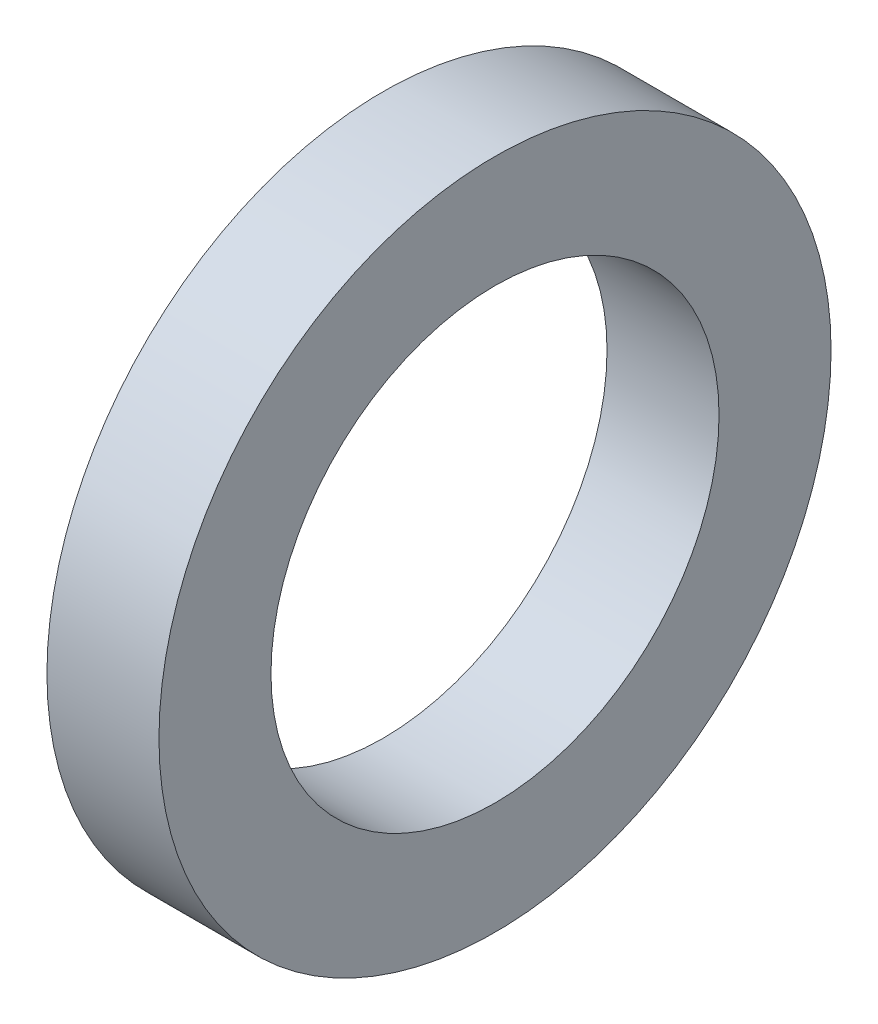
ISO-10303-21;
HEADER;
FILE_DESCRIPTION(('STEP AP214'),'2;1');
FILE_NAME('part.step','',(''),(''),'','','');
FILE_SCHEMA(('AUTOMOTIVE_DESIGN { 1 0 10303 214 1 1 1 1 }'));
ENDSEC;
DATA;
#1=APPLICATION_CONTEXT('core data for automotive mechanical design processes');
#2=APPLICATION_PROTOCOL_DEFINITION('international standard','automotive_design',2000,#1);
#3=PRODUCT_CONTEXT('',#1,'mechanical');
#4=PRODUCT('Part','Part','',(#3));
#5=PRODUCT_RELATED_PRODUCT_CATEGORY('part','',(#4));
#6=PRODUCT_DEFINITION_FORMATION('','',#4);
#7=PRODUCT_DEFINITION_CONTEXT('part definition',#1,'design');
#8=PRODUCT_DEFINITION('design','',#6,#7);
#9=PRODUCT_DEFINITION_SHAPE('','',#8);
#10=(LENGTH_UNIT() NAMED_UNIT(*) SI_UNIT(.MILLI.,.METRE.));
#11=(NAMED_UNIT(*) PLANE_ANGLE_UNIT() SI_UNIT($,.RADIAN.));
#12=(NAMED_UNIT(*) SI_UNIT($,.STERADIAN.) SOLID_ANGLE_UNIT());
#13=UNCERTAINTY_MEASURE_WITH_UNIT(LENGTH_MEASURE(1.E-05),#10,'distance_accuracy_value','');
#14=(GEOMETRIC_REPRESENTATION_CONTEXT(3) GLOBAL_UNCERTAINTY_ASSIGNED_CONTEXT((#13)) GLOBAL_UNIT_ASSIGNED_CONTEXT((#10,
#11,#12)) REPRESENTATION_CONTEXT('',''));
#15=CARTESIAN_POINT('',(0.,0.,0.));
#16=DIRECTION('',(0.,0.,1.));
#17=DIRECTION('',(1.,0.,0.));
#18=AXIS2_PLACEMENT_3D('',#15,#16,#17);
#19=CARTESIAN_POINT('',(-0.499999999999945,2.,0.));
#20=DIRECTION('',(1.,0.,0.));
#21=DIRECTION('',(0.,0.,-1.));
#22=AXIS2_PLACEMENT_3D('',#19,#20,#21);
#23=PLANE('',#22);
#24=CARTESIAN_POINT('',(-0.499999999999945,0.,0.));
#25=DIRECTION('',(-1.,0.,0.));
#26=DIRECTION('',(0.,0.,1.));
#27=AXIS2_PLACEMENT_3D('',#24,#25,#26);
#28=CIRCLE('',#27,2.);
#29=CARTESIAN_POINT('',(-0.499999999999945,0.,2.));
#30=VERTEX_POINT('',#29);
#31=EDGE_CURVE('E66',#30,#30,#28,.T.);
#32=ORIENTED_EDGE('',*,*,#31,.F.);
#33=EDGE_LOOP('',(#32));
#34=FACE_BOUND('',#33,.T.);
#35=CARTESIAN_POINT('',(-0.499999999999945,0.,0.));
#36=DIRECTION('',(-1.,0.,0.));
#37=DIRECTION('',(0.,0.,1.));
#38=AXIS2_PLACEMENT_3D('',#35,#36,#37);
#39=CIRCLE('',#38,3.);
#40=CARTESIAN_POINT('',(-0.499999999999945,0.,3.));
#41=VERTEX_POINT('',#40);
#42=EDGE_CURVE('E10',#41,#41,#39,.T.);
#43=ORIENTED_EDGE('',*,*,#42,.T.);
#44=EDGE_LOOP('',(#43));
#45=FACE_BOUND('',#44,.T.);
#46=ADVANCED_FACE('F45',(#34,#45),#23,.F.);
#47=CARTESIAN_POINT('',(-0.499999999999945,0.,0.));
#48=DIRECTION('',(-1.,0.,0.));
#49=DIRECTION('',(0.,0.,1.));
#50=AXIS2_PLACEMENT_3D('',#47,#48,#49);
#51=CYLINDRICAL_SURFACE('',#50,3.);
#52=ORIENTED_EDGE('',*,*,#42,.F.);
#53=EDGE_LOOP('',(#52));
#54=FACE_BOUND('',#53,.T.);
#55=CARTESIAN_POINT('',(0.499999999999945,0.,0.));
#56=DIRECTION('',(-1.,0.,0.));
#57=DIRECTION('',(0.,0.,1.));
#58=AXIS2_PLACEMENT_3D('',#55,#56,#57);
#59=CIRCLE('',#58,3.);
#60=CARTESIAN_POINT('',(0.499999999999945,0.,3.));
#61=VERTEX_POINT('',#60);
#62=EDGE_CURVE('E52',#61,#61,#59,.T.);
#63=ORIENTED_EDGE('',*,*,#62,.T.);
#64=EDGE_LOOP('',(#63));
#65=FACE_BOUND('',#64,.T.);
#66=ADVANCED_FACE('F78',(#54,#65),#51,.T.);
#67=CARTESIAN_POINT('',(0.499999999999945,2.,0.));
#68=DIRECTION('',(-1.,0.,0.));
#69=DIRECTION('',(0.,0.,1.));
#70=AXIS2_PLACEMENT_3D('',#67,#68,#69);
#71=PLANE('',#70);
#72=ORIENTED_EDGE('',*,*,#62,.F.);
#73=EDGE_LOOP('',(#72));
#74=FACE_BOUND('',#73,.T.);
#75=CARTESIAN_POINT('',(0.499999999999945,0.,0.));
#76=DIRECTION('',(-1.,0.,0.));
#77=DIRECTION('',(0.,0.,1.));
#78=AXIS2_PLACEMENT_3D('',#75,#76,#77);
#79=CIRCLE('',#78,2.);
#80=CARTESIAN_POINT('',(0.499999999999945,0.,2.));
#81=VERTEX_POINT('',#80);
#82=EDGE_CURVE('E59',#81,#81,#79,.T.);
#83=ORIENTED_EDGE('',*,*,#82,.T.);
#84=EDGE_LOOP('',(#83));
#85=FACE_BOUND('',#84,.T.);
#86=ADVANCED_FACE('F82',(#74,#85),#71,.F.);
#87=CARTESIAN_POINT('',(-0.499999999999945,0.,0.));
#88=DIRECTION('',(-1.,0.,0.));
#89=DIRECTION('',(0.,0.,1.));
#90=AXIS2_PLACEMENT_3D('',#87,#88,#89);
#91=CYLINDRICAL_SURFACE('',#90,2.);
#92=ORIENTED_EDGE('',*,*,#82,.F.);
#93=EDGE_LOOP('',(#92));
#94=FACE_BOUND('',#93,.T.);
#95=ORIENTED_EDGE('',*,*,#31,.T.);
#96=EDGE_LOOP('',(#95));
#97=FACE_BOUND('',#96,.T.);
#98=ADVANCED_FACE('F75',(#94,#97),#91,.F.);
#99=CLOSED_SHELL('',(#46,#66,#86,#98));
#100=MANIFOLD_SOLID_BREP('B2',#99);
#101=ADVANCED_BREP_SHAPE_REPRESENTATION('',(#18,#100),#14);
#102=SHAPE_DEFINITION_REPRESENTATION(#9,#101);
ENDSEC;
END-ISO-10303-21;
